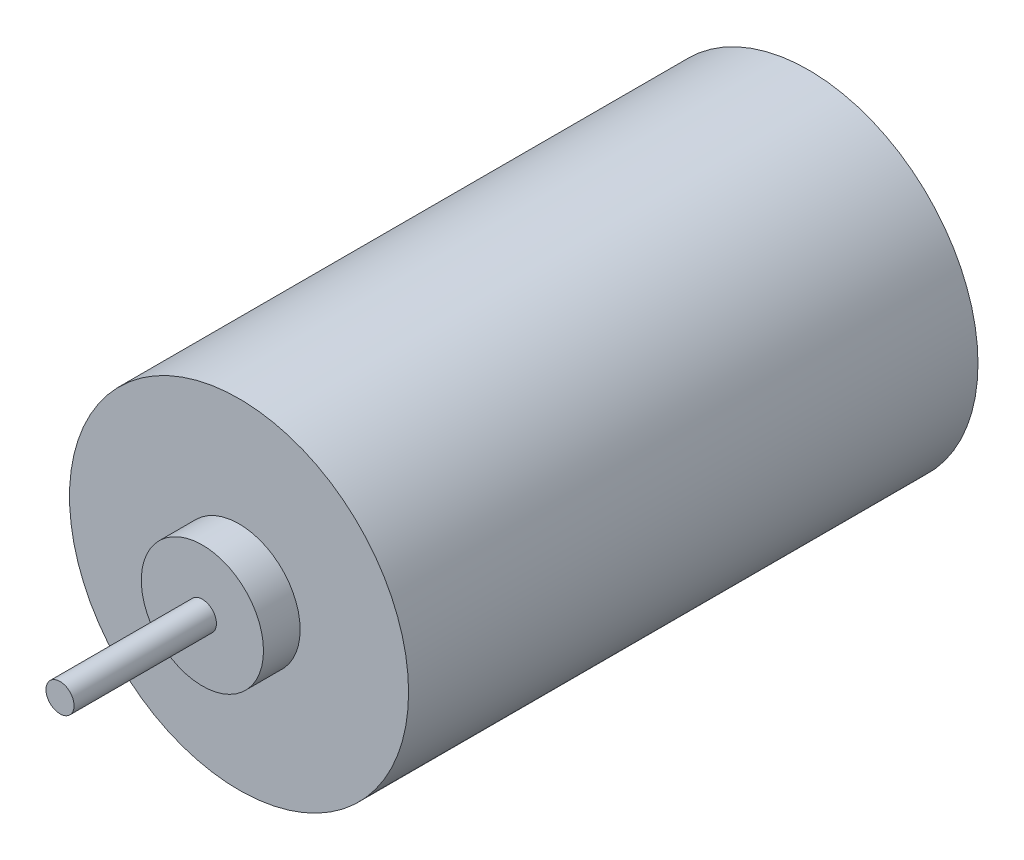
ISO-10303-21;
HEADER;
FILE_DESCRIPTION(('STEP AP214'),'2;1');
FILE_NAME('part.step','',(''),(''),'','','');
FILE_SCHEMA(('AUTOMOTIVE_DESIGN { 1 0 10303 214 1 1 1 1 }'));
ENDSEC;
DATA;
#1=APPLICATION_CONTEXT('core data for automotive mechanical design processes');
#2=APPLICATION_PROTOCOL_DEFINITION('international standard','automotive_design',2000,#1);
#3=PRODUCT_CONTEXT('',#1,'mechanical');
#4=PRODUCT('Part','Part','',(#3));
#5=PRODUCT_RELATED_PRODUCT_CATEGORY('part','',(#4));
#6=PRODUCT_DEFINITION_FORMATION('','',#4);
#7=PRODUCT_DEFINITION_CONTEXT('part definition',#1,'design');
#8=PRODUCT_DEFINITION('design','',#6,#7);
#9=PRODUCT_DEFINITION_SHAPE('','',#8);
#10=(LENGTH_UNIT() NAMED_UNIT(*) SI_UNIT(.MILLI.,.METRE.));
#11=(NAMED_UNIT(*) PLANE_ANGLE_UNIT() SI_UNIT($,.RADIAN.));
#12=(NAMED_UNIT(*) SI_UNIT($,.STERADIAN.) SOLID_ANGLE_UNIT());
#13=UNCERTAINTY_MEASURE_WITH_UNIT(LENGTH_MEASURE(1.E-05),#10,'distance_accuracy_value','');
#14=(GEOMETRIC_REPRESENTATION_CONTEXT(3) GLOBAL_UNCERTAINTY_ASSIGNED_CONTEXT((#13)) GLOBAL_UNIT_ASSIGNED_CONTEXT((#10,
#11,#12)) REPRESENTATION_CONTEXT('',''));
#15=CARTESIAN_POINT('',(0.,0.,0.));
#16=DIRECTION('',(0.,0.,1.));
#17=DIRECTION('',(1.,0.,0.));
#18=AXIS2_PLACEMENT_3D('',#15,#16,#17);
#19=CARTESIAN_POINT('',(0.,0.,49.6));
#20=DIRECTION('',(0.,0.,1.));
#21=DIRECTION('',(1.,0.,0.));
#22=AXIS2_PLACEMENT_3D('',#19,#20,#21);
#23=PLANE('',#22);
#24=CARTESIAN_POINT('',(0.,0.,49.6));
#25=DIRECTION('',(0.,0.,1.));
#26=DIRECTION('',(1.,0.,0.));
#27=AXIS2_PLACEMENT_3D('',#24,#25,#26);
#28=CIRCLE('',#27,5.);
#29=CARTESIAN_POINT('',(5.,0.,49.6));
#30=VERTEX_POINT('',#29);
#31=EDGE_CURVE('E41',#30,#30,#28,.T.);
#32=ORIENTED_EDGE('',*,*,#31,.T.);
#33=EDGE_LOOP('',(#32));
#34=FACE_BOUND('',#33,.T.);
#35=CARTESIAN_POINT('',(0.,0.,49.6));
#36=DIRECTION('',(0.,0.,1.));
#37=DIRECTION('',(1.,0.,0.));
#38=AXIS2_PLACEMENT_3D('',#35,#36,#37);
#39=CIRCLE('',#38,1.15);
#40=CARTESIAN_POINT('',(1.15,0.,49.6));
#41=VERTEX_POINT('',#40);
#42=EDGE_CURVE('E49',#41,#41,#39,.T.);
#43=ORIENTED_EDGE('',*,*,#42,.F.);
#44=EDGE_LOOP('',(#43));
#45=FACE_BOUND('',#44,.T.);
#46=ADVANCED_FACE('F30',(#34,#45),#23,.T.);
#47=CARTESIAN_POINT('',(0.,0.,46.6));
#48=DIRECTION('',(0.,0.,1.));
#49=DIRECTION('',(1.,0.,0.));
#50=AXIS2_PLACEMENT_3D('',#47,#48,#49);
#51=PLANE('',#50);
#52=CARTESIAN_POINT('',(0.,0.,46.6));
#53=DIRECTION('',(0.,0.,1.));
#54=DIRECTION('',(1.,0.,0.));
#55=AXIS2_PLACEMENT_3D('',#52,#53,#54);
#56=CIRCLE('',#55,13.875);
#57=CARTESIAN_POINT('',(13.875,0.,46.6));
#58=VERTEX_POINT('',#57);
#59=EDGE_CURVE('E10',#58,#58,#56,.T.);
#60=ORIENTED_EDGE('',*,*,#59,.T.);
#61=EDGE_LOOP('',(#60));
#62=FACE_BOUND('',#61,.T.);
#63=CARTESIAN_POINT('',(0.,0.,46.6));
#64=DIRECTION('',(0.,0.,1.));
#65=DIRECTION('',(1.,0.,0.));
#66=AXIS2_PLACEMENT_3D('',#63,#64,#65);
#67=CIRCLE('',#66,5.);
#68=CARTESIAN_POINT('',(5.,0.,46.6));
#69=VERTEX_POINT('',#68);
#70=EDGE_CURVE('E43',#69,#69,#67,.T.);
#71=ORIENTED_EDGE('',*,*,#70,.F.);
#72=EDGE_LOOP('',(#71));
#73=FACE_BOUND('',#72,.T.);
#74=ADVANCED_FACE('F65',(#62,#73),#51,.T.);
#75=CARTESIAN_POINT('',(0.,0.,46.6));
#76=DIRECTION('',(0.,0.,-1.));
#77=DIRECTION('',(-1.,0.,0.));
#78=AXIS2_PLACEMENT_3D('',#75,#76,#77);
#79=CYLINDRICAL_SURFACE('',#78,13.875);
#80=ORIENTED_EDGE('',*,*,#59,.F.);
#81=EDGE_LOOP('',(#80));
#82=FACE_BOUND('',#81,.T.);
#83=CARTESIAN_POINT('',(0.,0.,0.));
#84=DIRECTION('',(0.,0.,1.));
#85=DIRECTION('',(1.,0.,0.));
#86=AXIS2_PLACEMENT_3D('',#83,#84,#85);
#87=CIRCLE('',#86,13.875);
#88=CARTESIAN_POINT('',(13.875,0.,0.));
#89=VERTEX_POINT('',#88);
#90=EDGE_CURVE('E34',#89,#89,#87,.T.);
#91=ORIENTED_EDGE('',*,*,#90,.T.);
#92=EDGE_LOOP('',(#91));
#93=FACE_BOUND('',#92,.T.);
#94=ADVANCED_FACE('F32',(#82,#93),#79,.T.);
#95=CARTESIAN_POINT('',(0.,0.,0.));
#96=DIRECTION('',(0.,0.,1.));
#97=DIRECTION('',(1.,0.,0.));
#98=AXIS2_PLACEMENT_3D('',#95,#96,#97);
#99=PLANE('',#98);
#100=ORIENTED_EDGE('',*,*,#90,.F.);
#101=EDGE_LOOP('',(#100));
#102=FACE_BOUND('',#101,.T.);
#103=ADVANCED_FACE('F76',(#102),#99,.F.);
#104=CARTESIAN_POINT('',(0.,0.,49.6));
#105=DIRECTION('',(0.,0.,-1.));
#106=DIRECTION('',(-1.,0.,0.));
#107=AXIS2_PLACEMENT_3D('',#104,#105,#106);
#108=CYLINDRICAL_SURFACE('',#107,5.);
#109=ORIENTED_EDGE('',*,*,#31,.F.);
#110=EDGE_LOOP('',(#109));
#111=FACE_BOUND('',#110,.T.);
#112=ORIENTED_EDGE('',*,*,#70,.T.);
#113=EDGE_LOOP('',(#112));
#114=FACE_BOUND('',#113,.T.);
#115=ADVANCED_FACE('F60',(#111,#114),#108,.T.);
#116=CARTESIAN_POINT('',(0.,0.,61.25));
#117=DIRECTION('',(0.,0.,-1.));
#118=DIRECTION('',(-1.,0.,0.));
#119=AXIS2_PLACEMENT_3D('',#116,#117,#118);
#120=CYLINDRICAL_SURFACE('',#119,1.15);
#121=CARTESIAN_POINT('',(0.,0.,61.25));
#122=DIRECTION('',(0.,0.,1.));
#123=DIRECTION('',(1.,0.,0.));
#124=AXIS2_PLACEMENT_3D('',#121,#122,#123);
#125=CIRCLE('',#124,1.15);
#126=CARTESIAN_POINT('',(1.15,0.,61.25));
#127=VERTEX_POINT('',#126);
#128=EDGE_CURVE('E46',#127,#127,#125,.T.);
#129=ORIENTED_EDGE('',*,*,#128,.F.);
#130=EDGE_LOOP('',(#129));
#131=FACE_BOUND('',#130,.T.);
#132=ORIENTED_EDGE('',*,*,#42,.T.);
#133=EDGE_LOOP('',(#132));
#134=FACE_BOUND('',#133,.T.);
#135=ADVANCED_FACE('F57',(#131,#134),#120,.T.);
#136=CARTESIAN_POINT('',(0.,0.,61.25));
#137=DIRECTION('',(0.,0.,1.));
#138=DIRECTION('',(1.,0.,0.));
#139=AXIS2_PLACEMENT_3D('',#136,#137,#138);
#140=PLANE('',#139);
#141=ORIENTED_EDGE('',*,*,#128,.T.);
#142=EDGE_LOOP('',(#141));
#143=FACE_BOUND('',#142,.T.);
#144=ADVANCED_FACE('F55',(#143),#140,.T.);
#145=CLOSED_SHELL('',(#46,#74,#94,#103,#115,#135,#144));
#146=MANIFOLD_SOLID_BREP('B2',#145);
#147=ADVANCED_BREP_SHAPE_REPRESENTATION('',(#18,#146),#14);
#148=SHAPE_DEFINITION_REPRESENTATION(#9,#147);
ENDSEC;
END-ISO-10303-21;
